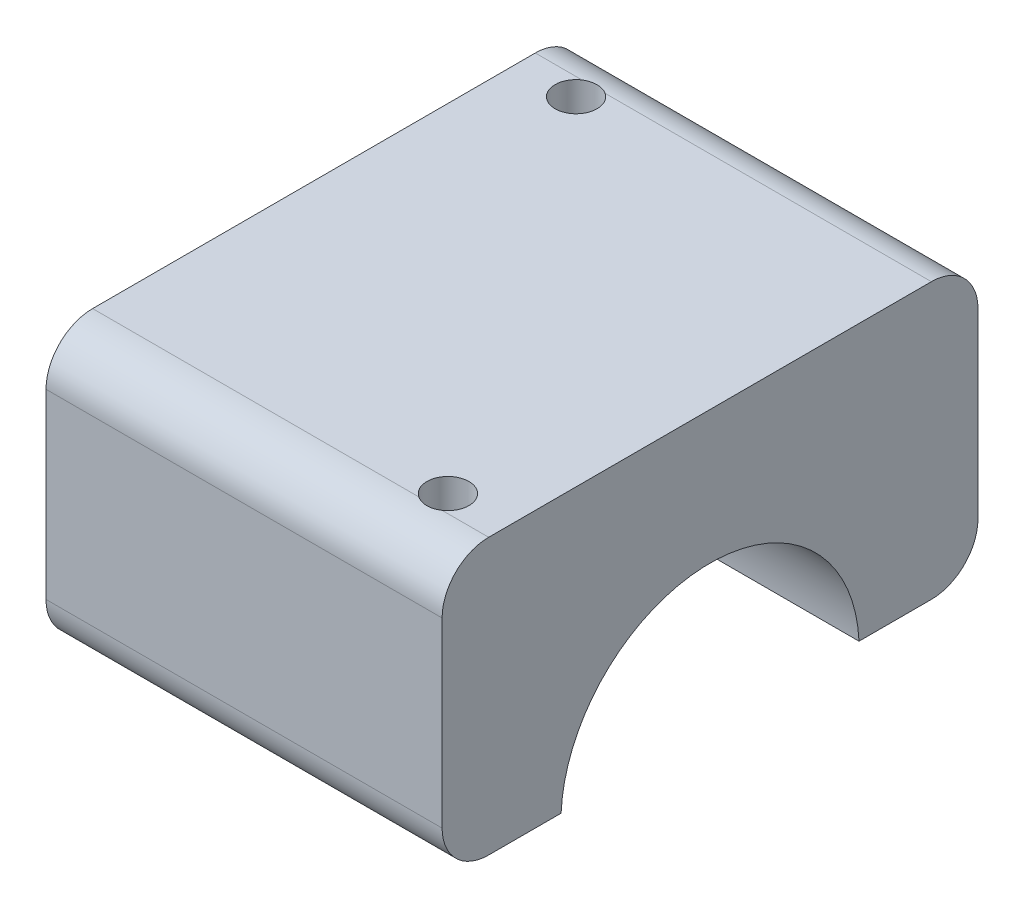
ISO-10303-21;
HEADER;
FILE_DESCRIPTION(('STEP AP214'),'2;1');
FILE_NAME('part.step','',(''),(''),'','','');
FILE_SCHEMA(('AUTOMOTIVE_DESIGN { 1 0 10303 214 1 1 1 1 }'));
ENDSEC;
DATA;
#1=APPLICATION_CONTEXT('core data for automotive mechanical design processes');
#2=APPLICATION_PROTOCOL_DEFINITION('international standard','automotive_design',2000,#1);
#3=PRODUCT_CONTEXT('',#1,'mechanical');
#4=PRODUCT('Part','Part','',(#3));
#5=PRODUCT_RELATED_PRODUCT_CATEGORY('part','',(#4));
#6=PRODUCT_DEFINITION_FORMATION('','',#4);
#7=PRODUCT_DEFINITION_CONTEXT('part definition',#1,'design');
#8=PRODUCT_DEFINITION('design','',#6,#7);
#9=PRODUCT_DEFINITION_SHAPE('','',#8);
#10=(LENGTH_UNIT() NAMED_UNIT(*) SI_UNIT(.MILLI.,.METRE.));
#11=(NAMED_UNIT(*) PLANE_ANGLE_UNIT() SI_UNIT($,.RADIAN.));
#12=(NAMED_UNIT(*) SI_UNIT($,.STERADIAN.) SOLID_ANGLE_UNIT());
#13=UNCERTAINTY_MEASURE_WITH_UNIT(LENGTH_MEASURE(1.E-05),#10,'distance_accuracy_value','');
#14=(GEOMETRIC_REPRESENTATION_CONTEXT(3) GLOBAL_UNCERTAINTY_ASSIGNED_CONTEXT((#13)) GLOBAL_UNIT_ASSIGNED_CONTEXT((#10,
#11,#12)) REPRESENTATION_CONTEXT('',''));
#15=CARTESIAN_POINT('',(0.,0.,0.));
#16=DIRECTION('',(0.,0.,1.));
#17=DIRECTION('',(1.,0.,0.));
#18=AXIS2_PLACEMENT_3D('',#15,#16,#17);
#19=CARTESIAN_POINT('',(17.,4.6,19.));
#20=DIRECTION('',(-1.,0.,0.));
#21=DIRECTION('',(0.,0.,1.));
#22=AXIS2_PLACEMENT_3D('',#19,#20,#21);
#23=CYLINDRICAL_SURFACE('',#22,4.);
#24=CARTESIAN_POINT('',(12.9949874371066,0.6,19.));
#25=CARTESIAN_POINT('',(12.9528080505859,0.600002290201008,19.0279782687762));
#26=CARTESIAN_POINT('',(12.9094699375662,0.600293109258532,19.054162436945));
#27=CARTESIAN_POINT('',(12.8207506643026,0.601246630542694,19.1027880961604));
#28=CARTESIAN_POINT('',(12.775369663094,0.601909303866988,19.1252298779078));
#29=CARTESIAN_POINT('',(12.6367080465194,0.60414515604213,19.1866521635867));
#30=CARTESIAN_POINT('',(12.5407755741953,0.605967454515857,19.2198177956695));
#31=CARTESIAN_POINT('',(12.3447108790185,0.609016111648687,19.2695824039112));
#32=CARTESIAN_POINT('',(12.2445771529861,0.610242254997947,19.2861753969049));
#33=CARTESIAN_POINT('',(12.0429252939834,0.611432977587128,19.3023260095373));
#34=CARTESIAN_POINT('',(11.9414072407699,0.611397629202322,19.3018846064864));
#35=CARTESIAN_POINT('',(11.7400149572337,0.6100843959537,19.2839916011113));
#36=CARTESIAN_POINT('',(11.6401391343925,0.608807797075412,19.266557603754));
#37=CARTESIAN_POINT('',(11.444762981889,0.605710678825216,19.2151942389305));
#38=CARTESIAN_POINT('',(11.3492591599958,0.603890602630139,19.181278297527));
#39=CARTESIAN_POINT('',(11.2134628948282,0.601745422922836,19.1197807652606));
#40=CARTESIAN_POINT('',(11.1703945654969,0.601136078493984,19.0981480345368));
#41=CARTESIAN_POINT('',(11.0862091669758,0.600264553601652,19.0515455180329));
#42=CARTESIAN_POINT('',(11.0450884560688,0.600001698383489,19.0265823227808));
#43=CARTESIAN_POINT('',(11.0050125628934,0.6,19.));
#44=B_SPLINE_CURVE_WITH_KNOTS('',3,(#24,#25,#26,#27,#28,#29,#30,#31,#32,#33,#34,#35,#36,#37,#38,
#39,#40,#41,#42,#43),.UNSPECIFIED.,.F.,.F.,(4,2,2,2,2,2,2,2,2,4),(0.,0.151748564164442,
0.30348533531734,0.606485618853393,0.90959525408197,1.21268749909945,1.51546606256915,
1.81799839737315,1.96246492195647,2.10664969408635),.UNSPECIFIED.);
#45=CARTESIAN_POINT('',(12.9949874371066,0.6,19.));
#46=VERTEX_POINT('',#45);
#47=CARTESIAN_POINT('',(11.0050125628934,0.6,19.));
#48=VERTEX_POINT('',#47);
#49=EDGE_CURVE('E136',#46,#48,#44,.T.);
#50=ORIENTED_EDGE('',*,*,#49,.F.);
#51=DIRECTION('',(-1.,0.,0.));
#52=VECTOR('',#51,1.);
#53=CARTESIAN_POINT('',(17.,0.6,19.));
#54=LINE('',#53,#52);
#55=CARTESIAN_POINT('',(17.,0.6,19.));
#56=VERTEX_POINT('',#55);
#57=EDGE_CURVE('E150',#56,#46,#54,.T.);
#58=ORIENTED_EDGE('',*,*,#57,.F.);
#59=CARTESIAN_POINT('',(17.,4.6,19.));
#60=DIRECTION('',(1.,0.,0.));
#61=DIRECTION('',(0.,0.,-1.));
#62=AXIS2_PLACEMENT_3D('',#59,#60,#61);
#63=CIRCLE('',#62,4.);
#64=CARTESIAN_POINT('',(17.,4.6,23.));
#65=VERTEX_POINT('',#64);
#66=EDGE_CURVE('E333',#65,#56,#63,.T.);
#67=ORIENTED_EDGE('',*,*,#66,.F.);
#68=DIRECTION('',(-1.,0.,0.));
#69=VECTOR('',#68,1.);
#70=CARTESIAN_POINT('',(17.,4.6,23.));
#71=LINE('',#70,#69);
#72=CARTESIAN_POINT('',(-17.,4.6,23.));
#73=VERTEX_POINT('',#72);
#74=EDGE_CURVE('E313',#65,#73,#71,.T.);
#75=ORIENTED_EDGE('',*,*,#74,.T.);
#76=CARTESIAN_POINT('',(-17.,4.6,19.));
#77=DIRECTION('',(1.,0.,0.));
#78=DIRECTION('',(0.,0.,-1.));
#79=AXIS2_PLACEMENT_3D('',#76,#77,#78);
#80=CIRCLE('',#79,4.);
#81=CARTESIAN_POINT('',(-17.,0.6,19.));
#82=VERTEX_POINT('',#81);
#83=EDGE_CURVE('E155',#73,#82,#80,.T.);
#84=ORIENTED_EDGE('',*,*,#83,.T.);
#85=EDGE_CURVE('E148',#48,#82,#54,.T.);
#86=ORIENTED_EDGE('',*,*,#85,.F.);
#87=EDGE_LOOP('',(#50,#58,#67,#75,#84,#86));
#88=FACE_BOUND('',#87,.T.);
#89=ADVANCED_FACE('F39',(#88),#23,.T.);
#90=CARTESIAN_POINT('',(17.,4.6,-19.));
#91=DIRECTION('',(-1.,0.,0.));
#92=DIRECTION('',(0.,0.,1.));
#93=AXIS2_PLACEMENT_3D('',#90,#91,#92);
#94=CYLINDRICAL_SURFACE('',#93,4.);
#95=CARTESIAN_POINT('',(-12.9949874371066,0.6,-19.));
#96=CARTESIAN_POINT('',(-12.9528080505859,0.600002290201008,-19.0279782687762));
#97=CARTESIAN_POINT('',(-12.9094699375662,0.600293109258532,-19.054162436945));
#98=CARTESIAN_POINT('',(-12.8207506643026,0.601246630542694,-19.1027880961604));
#99=CARTESIAN_POINT('',(-12.775369663094,0.601909303866988,-19.1252298779078));
#100=CARTESIAN_POINT('',(-12.6367080465194,0.60414515604213,-19.1866521635867));
#101=CARTESIAN_POINT('',(-12.5407755741953,0.605967454515857,-19.2198177956695));
#102=CARTESIAN_POINT('',(-12.3447108790185,0.609016111648687,-19.2695824039112));
#103=CARTESIAN_POINT('',(-12.2445771529861,0.610242254997947,-19.2861753969049));
#104=CARTESIAN_POINT('',(-12.0429252939834,0.611432977587128,-19.3023260095373));
#105=CARTESIAN_POINT('',(-11.9414072407699,0.611397629202322,-19.3018846064864));
#106=CARTESIAN_POINT('',(-11.7400149572337,0.6100843959537,-19.2839916011113));
#107=CARTESIAN_POINT('',(-11.6401391343925,0.608807797075412,-19.266557603754));
#108=CARTESIAN_POINT('',(-11.444762981889,0.605710678825216,-19.2151942389305));
#109=CARTESIAN_POINT('',(-11.3492591599958,0.603890602630139,-19.181278297527));
#110=CARTESIAN_POINT('',(-11.2134628948282,0.601745422922836,-19.1197807652606));
#111=CARTESIAN_POINT('',(-11.1703945654969,0.601136078493984,-19.0981480345368));
#112=CARTESIAN_POINT('',(-11.0862091669758,0.600264553601652,-19.0515455180329));
#113=CARTESIAN_POINT('',(-11.0450884560688,0.600001698383489,-19.0265823227808));
#114=CARTESIAN_POINT('',(-11.0050125628934,0.6,-19.));
#115=B_SPLINE_CURVE_WITH_KNOTS('',3,(#95,#96,#97,#98,#99,#100,#101,#102,#103,#104,#105,#106,
#107,#108,#109,#110,#111,#112,#113,#114),.UNSPECIFIED.,.F.,.F.,(4,2,2,2,2,2,2,2,2,4),(0.,
0.151748564164442,0.30348533531734,0.606485618853393,0.90959525408197,1.21268749909945,
1.51546606256915,1.81799839737315,1.96246492195647,2.10664969408635),.UNSPECIFIED.);
#116=CARTESIAN_POINT('',(-12.9949874371066,0.6,-19.));
#117=VERTEX_POINT('',#116);
#118=CARTESIAN_POINT('',(-11.0050125628934,0.6,-19.));
#119=VERTEX_POINT('',#118);
#120=EDGE_CURVE('E194',#117,#119,#115,.T.);
#121=ORIENTED_EDGE('',*,*,#120,.F.);
#122=DIRECTION('',(-1.,0.,0.));
#123=VECTOR('',#122,1.);
#124=CARTESIAN_POINT('',(17.,0.6,-19.));
#125=LINE('',#124,#123);
#126=CARTESIAN_POINT('',(-17.,0.6,-19.));
#127=VERTEX_POINT('',#126);
#128=EDGE_CURVE('E159',#117,#127,#125,.T.);
#129=ORIENTED_EDGE('',*,*,#128,.T.);
#130=CARTESIAN_POINT('',(-17.,4.6,-19.));
#131=DIRECTION('',(1.,0.,0.));
#132=DIRECTION('',(0.,0.,-1.));
#133=AXIS2_PLACEMENT_3D('',#130,#131,#132);
#134=CIRCLE('',#133,4.);
#135=CARTESIAN_POINT('',(-17.,4.6,-23.));
#136=VERTEX_POINT('',#135);
#137=EDGE_CURVE('E319',#127,#136,#134,.T.);
#138=ORIENTED_EDGE('',*,*,#137,.T.);
#139=DIRECTION('',(-1.,0.,0.));
#140=VECTOR('',#139,1.);
#141=CARTESIAN_POINT('',(17.,4.6,-23.));
#142=LINE('',#141,#140);
#143=CARTESIAN_POINT('',(17.,4.6,-23.));
#144=VERTEX_POINT('',#143);
#145=EDGE_CURVE('E293',#144,#136,#142,.T.);
#146=ORIENTED_EDGE('',*,*,#145,.F.);
#147=CARTESIAN_POINT('',(17.,4.6,-19.));
#148=DIRECTION('',(1.,0.,0.));
#149=DIRECTION('',(0.,0.,-1.));
#150=AXIS2_PLACEMENT_3D('',#147,#148,#149);
#151=CIRCLE('',#150,4.);
#152=CARTESIAN_POINT('',(17.,0.6,-19.));
#153=VERTEX_POINT('',#152);
#154=EDGE_CURVE('E291',#153,#144,#151,.T.);
#155=ORIENTED_EDGE('',*,*,#154,.F.);
#156=EDGE_CURVE('E156',#153,#119,#125,.T.);
#157=ORIENTED_EDGE('',*,*,#156,.T.);
#158=EDGE_LOOP('',(#121,#129,#138,#146,#155,#157));
#159=FACE_BOUND('',#158,.T.);
#160=ADVANCED_FACE('F205',(#159),#94,.T.);
#161=CARTESIAN_POINT('',(17.,20.221,-19.));
#162=DIRECTION('',(-1.,0.,0.));
#163=DIRECTION('',(0.,0.,1.));
#164=AXIS2_PLACEMENT_3D('',#161,#162,#163);
#165=CYLINDRICAL_SURFACE('',#164,4.);
#166=CARTESIAN_POINT('',(-11.0050125628934,24.221,-19.));
#167=CARTESIAN_POINT('',(-11.0471919494141,24.220997709799,-19.0279782687762));
#168=CARTESIAN_POINT('',(-11.0905300624338,24.2207068907415,-19.054162436945));
#169=CARTESIAN_POINT('',(-11.1792493356974,24.2197533694573,-19.1027880961604));
#170=CARTESIAN_POINT('',(-11.224630336906,24.219090696133,-19.1252298779078));
#171=CARTESIAN_POINT('',(-11.3632919534806,24.2168548439579,-19.1866521635867));
#172=CARTESIAN_POINT('',(-11.4592244258047,24.2150325454841,-19.2198177956695));
#173=CARTESIAN_POINT('',(-11.6552891209815,24.2119838883513,-19.2695824039112));
#174=CARTESIAN_POINT('',(-11.7554228470139,24.2107577450021,-19.2861753969049));
#175=CARTESIAN_POINT('',(-11.9570747060166,24.2095670224129,-19.3023260095373));
#176=CARTESIAN_POINT('',(-12.0585927592301,24.2096023707977,-19.3018846064864));
#177=CARTESIAN_POINT('',(-12.2599850427663,24.2109156040463,-19.2839916011113));
#178=CARTESIAN_POINT('',(-12.3598608656075,24.2121922029246,-19.266557603754));
#179=CARTESIAN_POINT('',(-12.555237018111,24.2152893211748,-19.2151942389305));
#180=CARTESIAN_POINT('',(-12.6507408400042,24.2171093973699,-19.181278297527));
#181=CARTESIAN_POINT('',(-12.7865371051718,24.2192545770772,-19.1197807652606));
#182=CARTESIAN_POINT('',(-12.8296054345031,24.219863921506,-19.0981480345368));
#183=CARTESIAN_POINT('',(-12.9137908330242,24.2207354463984,-19.0515455180329));
#184=CARTESIAN_POINT('',(-12.9549115439312,24.2209983016165,-19.0265823227808));
#185=CARTESIAN_POINT('',(-12.9949874371066,24.221,-19.));
#186=B_SPLINE_CURVE_WITH_KNOTS('',3,(#166,#167,#168,#169,#170,#171,#172,#173,#174,#175,#176,
#177,#178,#179,#180,#181,#182,#183,#184,#185),.UNSPECIFIED.,.F.,.F.,(4,2,2,2,2,2,2,2,2,4),(0.,
0.151748564164442,0.30348533531734,0.606485618853392,0.909595254081968,1.21268749909945,
1.51546606256915,1.81799839737315,1.96246492195647,2.10664969408635),.UNSPECIFIED.);
#187=CARTESIAN_POINT('',(-11.0050125628934,24.221,-19.));
#188=VERTEX_POINT('',#187);
#189=CARTESIAN_POINT('',(-12.9949874371066,24.221,-19.));
#190=VERTEX_POINT('',#189);
#191=EDGE_CURVE('E142',#188,#190,#186,.T.);
#192=ORIENTED_EDGE('',*,*,#191,.F.);
#193=DIRECTION('',(-1.,0.,0.));
#194=VECTOR('',#193,1.);
#195=CARTESIAN_POINT('',(17.,24.221,-19.));
#196=LINE('',#195,#194);
#197=CARTESIAN_POINT('',(17.,24.221,-19.));
#198=VERTEX_POINT('',#197);
#199=EDGE_CURVE('E343',#198,#188,#196,.T.);
#200=ORIENTED_EDGE('',*,*,#199,.F.);
#201=CARTESIAN_POINT('',(17.,20.221,-19.));
#202=DIRECTION('',(1.,0.,0.));
#203=DIRECTION('',(0.,0.,-1.));
#204=AXIS2_PLACEMENT_3D('',#201,#202,#203);
#205=CIRCLE('',#204,4.);
#206=CARTESIAN_POINT('',(17.,20.221,-23.));
#207=VERTEX_POINT('',#206);
#208=EDGE_CURVE('E299',#207,#198,#205,.T.);
#209=ORIENTED_EDGE('',*,*,#208,.F.);
#210=DIRECTION('',(-1.,0.,0.));
#211=VECTOR('',#210,1.);
#212=CARTESIAN_POINT('',(17.,20.221,-23.));
#213=LINE('',#212,#211);
#214=CARTESIAN_POINT('',(-17.,20.221,-23.));
#215=VERTEX_POINT('',#214);
#216=EDGE_CURVE('E346',#207,#215,#213,.T.);
#217=ORIENTED_EDGE('',*,*,#216,.T.);
#218=CARTESIAN_POINT('',(-17.,20.221,-19.));
#219=DIRECTION('',(1.,0.,0.));
#220=DIRECTION('',(0.,0.,-1.));
#221=AXIS2_PLACEMENT_3D('',#218,#219,#220);
#222=CIRCLE('',#221,4.);
#223=CARTESIAN_POINT('',(-17.,24.221,-19.));
#224=VERTEX_POINT('',#223);
#225=EDGE_CURVE('E323',#215,#224,#222,.T.);
#226=ORIENTED_EDGE('',*,*,#225,.T.);
#227=EDGE_CURVE('E342',#190,#224,#196,.T.);
#228=ORIENTED_EDGE('',*,*,#227,.F.);
#229=EDGE_LOOP('',(#192,#200,#209,#217,#226,#228));
#230=FACE_BOUND('',#229,.T.);
#231=ADVANCED_FACE('F201',(#230),#165,.T.);
#232=CARTESIAN_POINT('',(17.,20.221,19.));
#233=DIRECTION('',(-1.,0.,0.));
#234=DIRECTION('',(0.,0.,1.));
#235=AXIS2_PLACEMENT_3D('',#232,#233,#234);
#236=CYLINDRICAL_SURFACE('',#235,4.);
#237=CARTESIAN_POINT('',(11.0050125628934,24.221,19.));
#238=CARTESIAN_POINT('',(11.0471919494141,24.220997709799,19.0279782687762));
#239=CARTESIAN_POINT('',(11.0905300624338,24.2207068907415,19.054162436945));
#240=CARTESIAN_POINT('',(11.1792493356974,24.2197533694573,19.1027880961604));
#241=CARTESIAN_POINT('',(11.224630336906,24.219090696133,19.1252298779078));
#242=CARTESIAN_POINT('',(11.3632919534806,24.2168548439579,19.1866521635867));
#243=CARTESIAN_POINT('',(11.4592244258047,24.2150325454841,19.2198177956695));
#244=CARTESIAN_POINT('',(11.6552891209815,24.2119838883513,19.2695824039112));
#245=CARTESIAN_POINT('',(11.7554228470139,24.2107577450021,19.2861753969049));
#246=CARTESIAN_POINT('',(11.9570747060166,24.2095670224129,19.3023260095373));
#247=CARTESIAN_POINT('',(12.0585927592301,24.2096023707977,19.3018846064864));
#248=CARTESIAN_POINT('',(12.2599850427663,24.2109156040463,19.2839916011113));
#249=CARTESIAN_POINT('',(12.3598608656075,24.2121922029246,19.266557603754));
#250=CARTESIAN_POINT('',(12.555237018111,24.2152893211748,19.2151942389305));
#251=CARTESIAN_POINT('',(12.6507408400042,24.2171093973699,19.181278297527));
#252=CARTESIAN_POINT('',(12.7865371051718,24.2192545770772,19.1197807652606));
#253=CARTESIAN_POINT('',(12.8296054345031,24.219863921506,19.0981480345368));
#254=CARTESIAN_POINT('',(12.9137908330242,24.2207354463984,19.0515455180329));
#255=CARTESIAN_POINT('',(12.9549115439312,24.2209983016165,19.0265823227808));
#256=CARTESIAN_POINT('',(12.9949874371066,24.221,19.));
#257=B_SPLINE_CURVE_WITH_KNOTS('',3,(#237,#238,#239,#240,#241,#242,#243,#244,#245,#246,#247,
#248,#249,#250,#251,#252,#253,#254,#255,#256),.UNSPECIFIED.,.F.,.F.,(4,2,2,2,2,2,2,2,2,4),(0.,
0.151748564164442,0.30348533531734,0.606485618853392,0.909595254081968,1.21268749909945,
1.51546606256915,1.81799839737315,1.96246492195647,2.10664969408635),.UNSPECIFIED.);
#258=CARTESIAN_POINT('',(11.0050125628934,24.221,19.));
#259=VERTEX_POINT('',#258);
#260=CARTESIAN_POINT('',(12.9949874371066,24.221,19.));
#261=VERTEX_POINT('',#260);
#262=EDGE_CURVE('E47',#259,#261,#257,.T.);
#263=ORIENTED_EDGE('',*,*,#262,.F.);
#264=DIRECTION('',(-1.,0.,0.));
#265=VECTOR('',#264,1.);
#266=CARTESIAN_POINT('',(17.,24.221,19.));
#267=LINE('',#266,#265);
#268=CARTESIAN_POINT('',(-17.,24.221,19.));
#269=VERTEX_POINT('',#268);
#270=EDGE_CURVE('E338',#259,#269,#267,.T.);
#271=ORIENTED_EDGE('',*,*,#270,.T.);
#272=CARTESIAN_POINT('',(-17.,20.221,19.));
#273=DIRECTION('',(1.,0.,0.));
#274=DIRECTION('',(0.,0.,-1.));
#275=AXIS2_PLACEMENT_3D('',#272,#273,#274);
#276=CIRCLE('',#275,4.);
#277=CARTESIAN_POINT('',(-17.,20.221,23.));
#278=VERTEX_POINT('',#277);
#279=EDGE_CURVE('E329',#269,#278,#276,.T.);
#280=ORIENTED_EDGE('',*,*,#279,.T.);
#281=DIRECTION('',(-1.,0.,0.));
#282=VECTOR('',#281,1.);
#283=CARTESIAN_POINT('',(17.,20.221,23.));
#284=LINE('',#283,#282);
#285=CARTESIAN_POINT('',(17.,20.221,23.));
#286=VERTEX_POINT('',#285);
#287=EDGE_CURVE('E335',#286,#278,#284,.T.);
#288=ORIENTED_EDGE('',*,*,#287,.F.);
#289=CARTESIAN_POINT('',(17.,20.221,19.));
#290=DIRECTION('',(1.,0.,0.));
#291=DIRECTION('',(0.,0.,-1.));
#292=AXIS2_PLACEMENT_3D('',#289,#290,#291);
#293=CIRCLE('',#292,4.);
#294=CARTESIAN_POINT('',(17.,24.221,19.));
#295=VERTEX_POINT('',#294);
#296=EDGE_CURVE('E309',#295,#286,#293,.T.);
#297=ORIENTED_EDGE('',*,*,#296,.F.);
#298=EDGE_CURVE('E339',#295,#261,#267,.T.);
#299=ORIENTED_EDGE('',*,*,#298,.T.);
#300=EDGE_LOOP('',(#263,#271,#280,#288,#297,#299));
#301=FACE_BOUND('',#300,.T.);
#302=ADVANCED_FACE('F168',(#301),#236,.T.);
#303=CARTESIAN_POINT('',(17.,0.6,19.));
#304=DIRECTION('',(0.,1.,0.));
#305=DIRECTION('',(0.,0.,1.));
#306=AXIS2_PLACEMENT_3D('',#303,#304,#305);
#307=PLANE('',#306);
#308=CARTESIAN_POINT('',(12.,0.6,17.5));
#309=DIRECTION('',(0.,1.,0.));
#310=DIRECTION('',(0.,0.,1.));
#311=AXIS2_PLACEMENT_3D('',#308,#309,#310);
#312=CIRCLE('',#311,1.8);
#313=EDGE_CURVE('E53',#46,#48,#312,.T.);
#314=ORIENTED_EDGE('',*,*,#313,.T.);
#315=ORIENTED_EDGE('',*,*,#85,.T.);
#316=DIRECTION('',(0.,0.,-1.));
#317=VECTOR('',#316,1.);
#318=CARTESIAN_POINT('',(-17.,0.6,19.));
#319=LINE('',#318,#317);
#320=CARTESIAN_POINT('',(-17.,0.6,12.7859297667397));
#321=VERTEX_POINT('',#320);
#322=EDGE_CURVE('E317',#82,#321,#319,.T.);
#323=ORIENTED_EDGE('',*,*,#322,.T.);
#324=DIRECTION('',(1.,0.,0.));
#325=VECTOR('',#324,1.);
#326=CARTESIAN_POINT('',(-17.,0.6,12.7859297667397));
#327=LINE('',#326,#325);
#328=CARTESIAN_POINT('',(17.,0.6,12.7859297667397));
#329=VERTEX_POINT('',#328);
#330=EDGE_CURVE('E316',#321,#329,#327,.T.);
#331=ORIENTED_EDGE('',*,*,#330,.T.);
#332=DIRECTION('',(0.,0.,-1.));
#333=VECTOR('',#332,1.);
#334=CARTESIAN_POINT('',(17.,0.6,19.));
#335=LINE('',#334,#333);
#336=EDGE_CURVE('E297',#56,#329,#335,.T.);
#337=ORIENTED_EDGE('',*,*,#336,.F.);
#338=ORIENTED_EDGE('',*,*,#57,.T.);
#339=EDGE_LOOP('',(#314,#315,#323,#331,#337,#338));
#340=FACE_BOUND('',#339,.T.);
#341=ADVANCED_FACE('F146',(#340),#307,.F.);
#342=CARTESIAN_POINT('',(-12.,0.6,-17.5));
#343=DIRECTION('',(0.,1.,0.));
#344=DIRECTION('',(0.,0.,1.));
#345=AXIS2_PLACEMENT_3D('',#342,#343,#344);
#346=CIRCLE('',#345,1.8);
#347=EDGE_CURVE('E60',#117,#119,#346,.T.);
#348=ORIENTED_EDGE('',*,*,#347,.T.);
#349=ORIENTED_EDGE('',*,*,#156,.F.);
#350=CARTESIAN_POINT('',(17.,0.6,-12.7859297667397));
#351=VERTEX_POINT('',#350);
#352=EDGE_CURVE('E302',#351,#153,#335,.T.);
#353=ORIENTED_EDGE('',*,*,#352,.F.);
#354=DIRECTION('',(1.,0.,0.));
#355=VECTOR('',#354,1.);
#356=CARTESIAN_POINT('',(-17.,0.6,-12.7859297667397));
#357=LINE('',#356,#355);
#358=CARTESIAN_POINT('',(-17.,0.6,-12.7859297667397));
#359=VERTEX_POINT('',#358);
#360=EDGE_CURVE('E352',#351,#359,#357,.F.);
#361=ORIENTED_EDGE('',*,*,#360,.T.);
#362=EDGE_CURVE('E315',#359,#127,#319,.T.);
#363=ORIENTED_EDGE('',*,*,#362,.T.);
#364=ORIENTED_EDGE('',*,*,#128,.F.);
#365=EDGE_LOOP('',(#348,#349,#353,#361,#363,#364));
#366=FACE_BOUND('',#365,.T.);
#367=ADVANCED_FACE('F210',(#366),#307,.F.);
#368=CARTESIAN_POINT('',(17.,4.6,-23.));
#369=DIRECTION('',(0.,0.,1.));
#370=DIRECTION('',(1.,0.,0.));
#371=AXIS2_PLACEMENT_3D('',#368,#369,#370);
#372=PLANE('',#371);
#373=DIRECTION('',(0.,1.,0.));
#374=VECTOR('',#373,1.);
#375=CARTESIAN_POINT('',(-17.,4.6,-23.));
#376=LINE('',#375,#374);
#377=EDGE_CURVE('E321',#136,#215,#376,.T.);
#378=ORIENTED_EDGE('',*,*,#377,.T.);
#379=ORIENTED_EDGE('',*,*,#216,.F.);
#380=DIRECTION('',(0.,1.,0.));
#381=VECTOR('',#380,1.);
#382=CARTESIAN_POINT('',(17.,4.6,-23.));
#383=LINE('',#382,#381);
#384=EDGE_CURVE('E296',#144,#207,#383,.T.);
#385=ORIENTED_EDGE('',*,*,#384,.F.);
#386=ORIENTED_EDGE('',*,*,#145,.T.);
#387=EDGE_LOOP('',(#378,#379,#385,#386));
#388=FACE_BOUND('',#387,.T.);
#389=ADVANCED_FACE('F208',(#388),#372,.F.);
#390=CARTESIAN_POINT('',(17.,24.221,-19.));
#391=DIRECTION('',(0.,-1.,0.));
#392=DIRECTION('',(0.,0.,-1.));
#393=AXIS2_PLACEMENT_3D('',#390,#391,#392);
#394=PLANE('',#393);
#395=CARTESIAN_POINT('',(12.,24.221,17.5));
#396=DIRECTION('',(0.,-1.,0.));
#397=DIRECTION('',(0.,0.,-1.));
#398=AXIS2_PLACEMENT_3D('',#395,#396,#397);
#399=CIRCLE('',#398,1.8);
#400=EDGE_CURVE('E143',#261,#259,#399,.F.);
#401=ORIENTED_EDGE('',*,*,#400,.F.);
#402=ORIENTED_EDGE('',*,*,#298,.F.);
#403=DIRECTION('',(0.,0.,1.));
#404=VECTOR('',#403,1.);
#405=CARTESIAN_POINT('',(17.,24.221,-19.));
#406=LINE('',#405,#404);
#407=EDGE_CURVE('E307',#198,#295,#406,.T.);
#408=ORIENTED_EDGE('',*,*,#407,.F.);
#409=ORIENTED_EDGE('',*,*,#199,.T.);
#410=CARTESIAN_POINT('',(-12.,24.221,-17.5));
#411=DIRECTION('',(0.,-1.,0.));
#412=DIRECTION('',(0.,0.,-1.));
#413=AXIS2_PLACEMENT_3D('',#410,#411,#412);
#414=CIRCLE('',#413,1.8);
#415=EDGE_CURVE('E11',#190,#188,#414,.F.);
#416=ORIENTED_EDGE('',*,*,#415,.F.);
#417=ORIENTED_EDGE('',*,*,#227,.T.);
#418=DIRECTION('',(0.,0.,1.));
#419=VECTOR('',#418,1.);
#420=CARTESIAN_POINT('',(-17.,24.221,-19.));
#421=LINE('',#420,#419);
#422=EDGE_CURVE('E326',#224,#269,#421,.T.);
#423=ORIENTED_EDGE('',*,*,#422,.T.);
#424=ORIENTED_EDGE('',*,*,#270,.F.);
#425=EDGE_LOOP('',(#401,#402,#408,#409,#416,#417,#423,#424));
#426=FACE_BOUND('',#425,.T.);
#427=ADVANCED_FACE('F207',(#426),#394,.F.);
#428=CARTESIAN_POINT('',(17.,20.221,23.));
#429=DIRECTION('',(0.,0.,-1.));
#430=DIRECTION('',(-1.,0.,0.));
#431=AXIS2_PLACEMENT_3D('',#428,#429,#430);
#432=PLANE('',#431);
#433=DIRECTION('',(0.,-1.,0.));
#434=VECTOR('',#433,1.);
#435=CARTESIAN_POINT('',(-17.,20.221,23.));
#436=LINE('',#435,#434);
#437=EDGE_CURVE('E331',#278,#73,#436,.T.);
#438=ORIENTED_EDGE('',*,*,#437,.T.);
#439=ORIENTED_EDGE('',*,*,#74,.F.);
#440=DIRECTION('',(0.,-1.,0.));
#441=VECTOR('',#440,1.);
#442=CARTESIAN_POINT('',(17.,20.221,23.));
#443=LINE('',#442,#441);
#444=EDGE_CURVE('E311',#286,#65,#443,.T.);
#445=ORIENTED_EDGE('',*,*,#444,.F.);
#446=ORIENTED_EDGE('',*,*,#287,.T.);
#447=EDGE_LOOP('',(#438,#439,#445,#446));
#448=FACE_BOUND('',#447,.T.);
#449=ADVANCED_FACE('F376',(#448),#432,.F.);
#450=CARTESIAN_POINT('',(17.,4.6,19.));
#451=DIRECTION('',(1.,0.,0.));
#452=DIRECTION('',(0.,0.,-1.));
#453=AXIS2_PLACEMENT_3D('',#450,#451,#452);
#454=PLANE('',#453);
#455=CARTESIAN_POINT('',(17.,0.,0.));
#456=DIRECTION('',(1.,0.,0.));
#457=DIRECTION('',(0.,0.,-1.));
#458=AXIS2_PLACEMENT_3D('',#455,#456,#457);
#459=CIRCLE('',#458,12.8);
#460=EDGE_CURVE('E285',#351,#329,#459,.T.);
#461=ORIENTED_EDGE('',*,*,#460,.F.);
#462=ORIENTED_EDGE('',*,*,#352,.T.);
#463=ORIENTED_EDGE('',*,*,#154,.T.);
#464=ORIENTED_EDGE('',*,*,#384,.T.);
#465=ORIENTED_EDGE('',*,*,#208,.T.);
#466=ORIENTED_EDGE('',*,*,#407,.T.);
#467=ORIENTED_EDGE('',*,*,#296,.T.);
#468=ORIENTED_EDGE('',*,*,#444,.T.);
#469=ORIENTED_EDGE('',*,*,#66,.T.);
#470=ORIENTED_EDGE('',*,*,#336,.T.);
#471=EDGE_LOOP('',(#461,#462,#463,#464,#465,#466,#467,#468,#469,#470));
#472=FACE_BOUND('',#471,.T.);
#473=ADVANCED_FACE('F363',(#472),#454,.T.);
#474=CARTESIAN_POINT('',(-17.,4.6,19.));
#475=DIRECTION('',(1.,0.,0.));
#476=DIRECTION('',(0.,0.,-1.));
#477=AXIS2_PLACEMENT_3D('',#474,#475,#476);
#478=PLANE('',#477);
#479=ORIENTED_EDGE('',*,*,#362,.F.);
#480=CARTESIAN_POINT('',(-17.,0.,0.));
#481=DIRECTION('',(1.,0.,0.));
#482=DIRECTION('',(0.,0.,-1.));
#483=AXIS2_PLACEMENT_3D('',#480,#481,#482);
#484=CIRCLE('',#483,12.8);
#485=EDGE_CURVE('E383',#359,#321,#484,.T.);
#486=ORIENTED_EDGE('',*,*,#485,.T.);
#487=ORIENTED_EDGE('',*,*,#322,.F.);
#488=ORIENTED_EDGE('',*,*,#83,.F.);
#489=ORIENTED_EDGE('',*,*,#437,.F.);
#490=ORIENTED_EDGE('',*,*,#279,.F.);
#491=ORIENTED_EDGE('',*,*,#422,.F.);
#492=ORIENTED_EDGE('',*,*,#225,.F.);
#493=ORIENTED_EDGE('',*,*,#377,.F.);
#494=ORIENTED_EDGE('',*,*,#137,.F.);
#495=EDGE_LOOP('',(#479,#486,#487,#488,#489,#490,#491,#492,#493,#494));
#496=FACE_BOUND('',#495,.T.);
#497=ADVANCED_FACE('F254',(#496),#478,.F.);
#498=CARTESIAN_POINT('',(-17.,0.,0.));
#499=DIRECTION('',(1.,0.,0.));
#500=DIRECTION('',(0.,0.,-1.));
#501=AXIS2_PLACEMENT_3D('',#498,#499,#500);
#502=CYLINDRICAL_SURFACE('',#501,12.8);
#503=ORIENTED_EDGE('',*,*,#485,.F.);
#504=ORIENTED_EDGE('',*,*,#360,.F.);
#505=ORIENTED_EDGE('',*,*,#460,.T.);
#506=ORIENTED_EDGE('',*,*,#330,.F.);
#507=EDGE_LOOP('',(#503,#504,#505,#506));
#508=FACE_BOUND('',#507,.T.);
#509=ADVANCED_FACE('F176',(#508),#502,.F.);
#510=CARTESIAN_POINT('',(12.,24.821,17.5));
#511=DIRECTION('',(0.,-1.,0.));
#512=DIRECTION('',(0.,0.,-1.));
#513=AXIS2_PLACEMENT_3D('',#510,#511,#512);
#514=CYLINDRICAL_SURFACE('',#513,1.8);
#515=ORIENTED_EDGE('',*,*,#400,.T.);
#516=ORIENTED_EDGE('',*,*,#262,.T.);
#517=EDGE_LOOP('',(#515,#516));
#518=FACE_BOUND('',#517,.T.);
#519=ORIENTED_EDGE('',*,*,#49,.T.);
#520=ORIENTED_EDGE('',*,*,#313,.F.);
#521=EDGE_LOOP('',(#519,#520));
#522=FACE_BOUND('',#521,.T.);
#523=ADVANCED_FACE('F137',(#518,#522),#514,.F.);
#524=CARTESIAN_POINT('',(-12.,24.821,-17.5));
#525=DIRECTION('',(0.,-1.,0.));
#526=DIRECTION('',(0.,0.,-1.));
#527=AXIS2_PLACEMENT_3D('',#524,#525,#526);
#528=CYLINDRICAL_SURFACE('',#527,1.8);
#529=ORIENTED_EDGE('',*,*,#191,.T.);
#530=ORIENTED_EDGE('',*,*,#415,.T.);
#531=EDGE_LOOP('',(#529,#530));
#532=FACE_BOUND('',#531,.T.);
#533=ORIENTED_EDGE('',*,*,#120,.T.);
#534=ORIENTED_EDGE('',*,*,#347,.F.);
#535=EDGE_LOOP('',(#533,#534));
#536=FACE_BOUND('',#535,.T.);
#537=ADVANCED_FACE('F175',(#532,#536),#528,.F.);
#538=CLOSED_SHELL('',(#89,#160,#231,#302,#341,#367,#389,#427,#449,#473,#497,#509,#523,#537));
#539=MANIFOLD_SOLID_BREP('B2',#538);
#540=ADVANCED_BREP_SHAPE_REPRESENTATION('',(#18,#539),#14);
#541=SHAPE_DEFINITION_REPRESENTATION(#9,#540);
ENDSEC;
END-ISO-10303-21;
